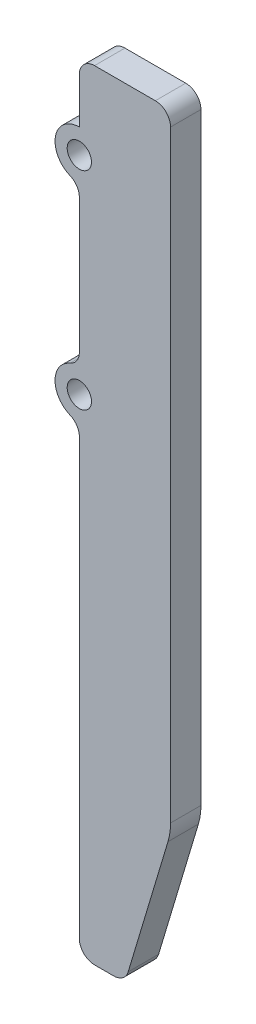
ISO-10303-21;
HEADER;
FILE_DESCRIPTION(('STEP AP214'),'2;1');
FILE_NAME('part.step','',(''),(''),'','','');
FILE_SCHEMA(('AUTOMOTIVE_DESIGN { 1 0 10303 214 1 1 1 1 }'));
ENDSEC;
DATA;
#1=APPLICATION_CONTEXT('core data for automotive mechanical design processes');
#2=APPLICATION_PROTOCOL_DEFINITION('international standard','automotive_design',2000,#1);
#3=PRODUCT_CONTEXT('',#1,'mechanical');
#4=PRODUCT('Part','Part','',(#3));
#5=PRODUCT_RELATED_PRODUCT_CATEGORY('part','',(#4));
#6=PRODUCT_DEFINITION_FORMATION('','',#4);
#7=PRODUCT_DEFINITION_CONTEXT('part definition',#1,'design');
#8=PRODUCT_DEFINITION('design','',#6,#7);
#9=PRODUCT_DEFINITION_SHAPE('','',#8);
#10=(LENGTH_UNIT() NAMED_UNIT(*) SI_UNIT(.MILLI.,.METRE.));
#11=(NAMED_UNIT(*) PLANE_ANGLE_UNIT() SI_UNIT($,.RADIAN.));
#12=(NAMED_UNIT(*) SI_UNIT($,.STERADIAN.) SOLID_ANGLE_UNIT());
#13=UNCERTAINTY_MEASURE_WITH_UNIT(LENGTH_MEASURE(1.E-05),#10,'distance_accuracy_value','');
#14=(GEOMETRIC_REPRESENTATION_CONTEXT(3) GLOBAL_UNCERTAINTY_ASSIGNED_CONTEXT((#13)) GLOBAL_UNIT_ASSIGNED_CONTEXT((#10,
#11,#12)) REPRESENTATION_CONTEXT('',''));
#15=CARTESIAN_POINT('',(0.,0.,0.));
#16=DIRECTION('',(0.,0.,1.));
#17=DIRECTION('',(1.,0.,0.));
#18=AXIS2_PLACEMENT_3D('',#15,#16,#17);
#19=CARTESIAN_POINT('',(-24.5001697636165,82.5534534534534,5.));
#20=DIRECTION('',(0.,0.,1.));
#21=DIRECTION('',(1.,0.,0.));
#22=AXIS2_PLACEMENT_3D('',#19,#20,#21);
#23=PLANE('',#22);
#24=CARTESIAN_POINT('',(-24.5001697636165,82.5534534534534,5.));
#25=DIRECTION('',(0.,0.,1.));
#26=DIRECTION('',(1.,0.,0.));
#27=AXIS2_PLACEMENT_3D('',#24,#25,#26);
#28=CIRCLE('',#27,2.);
#29=CARTESIAN_POINT('',(-22.5001697636165,82.5534534534534,5.));
#30=VERTEX_POINT('',#29);
#31=EDGE_CURVE('E206',#30,#30,#28,.T.);
#32=ORIENTED_EDGE('',*,*,#31,.F.);
#33=EDGE_LOOP('',(#32));
#34=FACE_BOUND('',#33,.T.);
#35=DIRECTION('',(0.287347885566345,0.957826285221151,0.));
#36=VECTOR('',#35,1.);
#37=CARTESIAN_POINT('',(-17.0001697636165,-31.5465465465466,5.));
#38=LINE('',#37,#36);
#39=CARTESIAN_POINT('',(-16.4656806777913,-29.7649162604624,5.));
#40=VERTEX_POINT('',#39);
#41=CARTESIAN_POINT('',(-9.921906911405,-7.95233703917485,5.));
#42=VERTEX_POINT('',#41);
#43=EDGE_CURVE('E198',#40,#42,#38,.T.);
#44=ORIENTED_EDGE('',*,*,#43,.T.);
#45=CARTESIAN_POINT('',(-19.5001697636165,-5.07885818351139,5.));
#46=DIRECTION('',(0.,0.,1.));
#47=DIRECTION('',(1.,0.,0.));
#48=AXIS2_PLACEMENT_3D('',#45,#46,#47);
#49=CIRCLE('',#48,10.);
#50=CARTESIAN_POINT('',(-9.50016976361651,-5.07885818351139,5.));
#51=VERTEX_POINT('',#50);
#52=EDGE_CURVE('E11',#42,#51,#49,.T.);
#53=ORIENTED_EDGE('',*,*,#52,.T.);
#54=DIRECTION('',(0.,1.,0.));
#55=VECTOR('',#54,1.);
#56=CARTESIAN_POINT('',(-9.50016976361652,96.5534534534534,5.));
#57=LINE('',#56,#55);
#58=CARTESIAN_POINT('',(-9.50016976361652,94.0534534534534,5.));
#59=VERTEX_POINT('',#58);
#60=EDGE_CURVE('E200',#51,#59,#57,.T.);
#61=ORIENTED_EDGE('',*,*,#60,.T.);
#62=CARTESIAN_POINT('',(-12.0001697636165,94.0534534534534,5.));
#63=DIRECTION('',(0.,0.,1.));
#64=DIRECTION('',(1.,0.,0.));
#65=AXIS2_PLACEMENT_3D('',#62,#63,#64);
#66=CIRCLE('',#65,2.5);
#67=CARTESIAN_POINT('',(-12.0001697636165,96.5534534534534,5.));
#68=VERTEX_POINT('',#67);
#69=EDGE_CURVE('E245',#59,#68,#66,.T.);
#70=ORIENTED_EDGE('',*,*,#69,.T.);
#71=DIRECTION('',(-1.,0.,0.));
#72=VECTOR('',#71,1.);
#73=CARTESIAN_POINT('',(-9.50016976361652,96.5534534534534,5.));
#74=LINE('',#73,#72);
#75=CARTESIAN_POINT('',(-22.0001697636165,96.5534534534534,5.));
#76=VERTEX_POINT('',#75);
#77=EDGE_CURVE('E166',#68,#76,#74,.T.);
#78=ORIENTED_EDGE('',*,*,#77,.T.);
#79=CARTESIAN_POINT('',(-22.0001697636165,94.0534534534534,5.));
#80=DIRECTION('',(0.,0.,1.));
#81=DIRECTION('',(1.,0.,0.));
#82=AXIS2_PLACEMENT_3D('',#79,#80,#81);
#83=CIRCLE('',#82,2.5);
#84=CARTESIAN_POINT('',(-24.5001697636165,94.0534534534534,5.));
#85=VERTEX_POINT('',#84);
#86=EDGE_CURVE('E161',#76,#85,#83,.T.);
#87=ORIENTED_EDGE('',*,*,#86,.T.);
#88=DIRECTION('',(0.,-1.,0.));
#89=VECTOR('',#88,1.);
#90=CARTESIAN_POINT('',(-24.5001697636165,96.5534534534534,5.));
#91=LINE('',#90,#89);
#92=CARTESIAN_POINT('',(-24.5001697636165,86.5534534534534,5.));
#93=VERTEX_POINT('',#92);
#94=EDGE_CURVE('E153',#85,#93,#91,.T.);
#95=ORIENTED_EDGE('',*,*,#94,.T.);
#96=CARTESIAN_POINT('',(-24.5001697636165,82.5534534534534,5.));
#97=DIRECTION('',(0.,0.,1.));
#98=DIRECTION('',(1.,0.,0.));
#99=AXIS2_PLACEMENT_3D('',#96,#97,#98);
#100=CIRCLE('',#99,4.);
#101=CARTESIAN_POINT('',(-26.038631302078,78.8611457611457,5.));
#102=VERTEX_POINT('',#101);
#103=EDGE_CURVE('E157',#93,#102,#100,.T.);
#104=ORIENTED_EDGE('',*,*,#103,.T.);
#105=CARTESIAN_POINT('',(-27.0001697636165,76.5534534534534,5.));
#106=DIRECTION('',(0.,0.,1.));
#107=DIRECTION('',(1.,0.,0.));
#108=AXIS2_PLACEMENT_3D('',#105,#106,#107);
#109=CIRCLE('',#108,2.5);
#110=CARTESIAN_POINT('',(-24.5001697636165,76.5534534534534,5.));
#111=VERTEX_POINT('',#110);
#112=EDGE_CURVE('E284',#102,#111,#109,.F.);
#113=ORIENTED_EDGE('',*,*,#112,.T.);
#114=DIRECTION('',(0.,-1.,0.));
#115=VECTOR('',#114,1.);
#116=CARTESIAN_POINT('',(-24.5001697636165,78.5534534534534,5.));
#117=LINE('',#116,#115);
#118=CARTESIAN_POINT('',(-24.5001697636165,54.4534534534535,5.));
#119=VERTEX_POINT('',#118);
#120=EDGE_CURVE('E180',#111,#119,#117,.T.);
#121=ORIENTED_EDGE('',*,*,#120,.T.);
#122=CARTESIAN_POINT('',(-27.0001697636165,54.4534534534535,5.));
#123=DIRECTION('',(0.,0.,1.));
#124=DIRECTION('',(1.,0.,0.));
#125=AXIS2_PLACEMENT_3D('',#122,#123,#124);
#126=CIRCLE('',#125,2.5);
#127=CARTESIAN_POINT('',(-26.038631302078,52.1457611457611,5.));
#128=VERTEX_POINT('',#127);
#129=EDGE_CURVE('E276',#119,#128,#126,.F.);
#130=ORIENTED_EDGE('',*,*,#129,.T.);
#131=CARTESIAN_POINT('',(-24.5001697636165,48.4534534534534,5.));
#132=DIRECTION('',(0.,0.,1.));
#133=DIRECTION('',(1.,0.,0.));
#134=AXIS2_PLACEMENT_3D('',#131,#132,#133);
#135=CIRCLE('',#134,4.);
#136=CARTESIAN_POINT('',(-26.038631302078,44.7611457611458,5.));
#137=VERTEX_POINT('',#136);
#138=EDGE_CURVE('E183',#128,#137,#135,.T.);
#139=ORIENTED_EDGE('',*,*,#138,.T.);
#140=CARTESIAN_POINT('',(-27.0001697636165,42.4534534534534,5.));
#141=DIRECTION('',(0.,0.,1.));
#142=DIRECTION('',(1.,0.,0.));
#143=AXIS2_PLACEMENT_3D('',#140,#141,#142);
#144=CIRCLE('',#143,2.5);
#145=CARTESIAN_POINT('',(-24.5001697636165,42.4534534534534,5.));
#146=VERTEX_POINT('',#145);
#147=EDGE_CURVE('E280',#137,#146,#144,.F.);
#148=ORIENTED_EDGE('',*,*,#147,.T.);
#149=DIRECTION('',(0.,-1.,0.));
#150=VECTOR('',#149,1.);
#151=CARTESIAN_POINT('',(-24.5001697636165,44.4534534534534,5.));
#152=LINE('',#151,#150);
#153=CARTESIAN_POINT('',(-24.5001697636165,-29.0465465465466,5.));
#154=VERTEX_POINT('',#153);
#155=EDGE_CURVE('E193',#146,#154,#152,.T.);
#156=ORIENTED_EDGE('',*,*,#155,.T.);
#157=CARTESIAN_POINT('',(-22.0001697636165,-29.0465465465466,5.));
#158=DIRECTION('',(0.,0.,1.));
#159=DIRECTION('',(1.,0.,0.));
#160=AXIS2_PLACEMENT_3D('',#157,#158,#159);
#161=CIRCLE('',#160,2.5);
#162=CARTESIAN_POINT('',(-22.0001697636165,-31.5465465465466,5.));
#163=VERTEX_POINT('',#162);
#164=EDGE_CURVE('E242',#154,#163,#161,.T.);
#165=ORIENTED_EDGE('',*,*,#164,.T.);
#166=DIRECTION('',(1.,0.,0.));
#167=VECTOR('',#166,1.);
#168=CARTESIAN_POINT('',(-24.5001697636165,-31.5465465465466,5.));
#169=LINE('',#168,#167);
#170=CARTESIAN_POINT('',(-18.8602463908441,-31.5465465465466,5.));
#171=VERTEX_POINT('',#170);
#172=EDGE_CURVE('E195',#163,#171,#169,.T.);
#173=ORIENTED_EDGE('',*,*,#172,.T.);
#174=CARTESIAN_POINT('',(-18.8602463908441,-29.0465465465466,5.));
#175=DIRECTION('',(0.,0.,1.));
#176=DIRECTION('',(1.,0.,0.));
#177=AXIS2_PLACEMENT_3D('',#174,#175,#176);
#178=CIRCLE('',#177,2.5);
#179=EDGE_CURVE('E240',#171,#40,#178,.T.);
#180=ORIENTED_EDGE('',*,*,#179,.T.);
#181=EDGE_LOOP('',(#44,#53,#61,#70,#78,#87,#95,#104,#113,#121,#130,#139,#148,#156,#165,#173,#180));
#182=FACE_BOUND('',#181,.T.);
#183=CARTESIAN_POINT('',(-24.5001697636165,48.4534534534534,5.));
#184=DIRECTION('',(0.,0.,1.));
#185=DIRECTION('',(1.,0.,0.));
#186=AXIS2_PLACEMENT_3D('',#183,#184,#185);
#187=CIRCLE('',#186,2.);
#188=CARTESIAN_POINT('',(-22.5001697636165,48.4534534534534,5.));
#189=VERTEX_POINT('',#188);
#190=EDGE_CURVE('E525',#189,#189,#187,.T.);
#191=ORIENTED_EDGE('',*,*,#190,.F.);
#192=EDGE_LOOP('',(#191));
#193=FACE_BOUND('',#192,.T.);
#194=ADVANCED_FACE('F34',(#34,#182,#193),#23,.T.);
#195=CARTESIAN_POINT('',(-24.5001697636165,82.5534534534534,0.));
#196=DIRECTION('',(0.,0.,1.));
#197=DIRECTION('',(1.,0.,0.));
#198=AXIS2_PLACEMENT_3D('',#195,#196,#197);
#199=PLANE('',#198);
#200=DIRECTION('',(0.,1.,0.));
#201=VECTOR('',#200,1.);
#202=CARTESIAN_POINT('',(-9.50016976361652,96.5534534534534,0.));
#203=LINE('',#202,#201);
#204=CARTESIAN_POINT('',(-9.50016976361651,-5.07885818351139,0.));
#205=VERTEX_POINT('',#204);
#206=CARTESIAN_POINT('',(-9.50016976361652,94.0534534534534,0.));
#207=VERTEX_POINT('',#206);
#208=EDGE_CURVE('E219',#205,#207,#203,.T.);
#209=ORIENTED_EDGE('',*,*,#208,.F.);
#210=CARTESIAN_POINT('',(-19.5001697636165,-5.07885818351139,0.));
#211=DIRECTION('',(0.,0.,1.));
#212=DIRECTION('',(1.,0.,0.));
#213=AXIS2_PLACEMENT_3D('',#210,#211,#212);
#214=CIRCLE('',#213,10.);
#215=CARTESIAN_POINT('',(-9.921906911405,-7.95233703917485,0.));
#216=VERTEX_POINT('',#215);
#217=EDGE_CURVE('E56',#205,#216,#214,.F.);
#218=ORIENTED_EDGE('',*,*,#217,.T.);
#219=DIRECTION('',(0.287347885566345,0.957826285221151,0.));
#220=VECTOR('',#219,1.);
#221=CARTESIAN_POINT('',(-17.0001697636165,-31.5465465465466,0.));
#222=LINE('',#221,#220);
#223=CARTESIAN_POINT('',(-16.4656806777913,-29.7649162604624,0.));
#224=VERTEX_POINT('',#223);
#225=EDGE_CURVE('E217',#224,#216,#222,.T.);
#226=ORIENTED_EDGE('',*,*,#225,.F.);
#227=CARTESIAN_POINT('',(-18.8602463908441,-29.0465465465466,0.));
#228=DIRECTION('',(0.,0.,1.));
#229=DIRECTION('',(1.,0.,0.));
#230=AXIS2_PLACEMENT_3D('',#227,#228,#229);
#231=CIRCLE('',#230,2.5);
#232=CARTESIAN_POINT('',(-18.8602463908441,-31.5465465465466,0.));
#233=VERTEX_POINT('',#232);
#234=EDGE_CURVE('E227',#224,#233,#231,.F.);
#235=ORIENTED_EDGE('',*,*,#234,.T.);
#236=DIRECTION('',(1.,0.,0.));
#237=VECTOR('',#236,1.);
#238=CARTESIAN_POINT('',(-24.5001697636165,-31.5465465465466,0.));
#239=LINE('',#238,#237);
#240=CARTESIAN_POINT('',(-22.0001697636165,-31.5465465465466,0.));
#241=VERTEX_POINT('',#240);
#242=EDGE_CURVE('E214',#241,#233,#239,.T.);
#243=ORIENTED_EDGE('',*,*,#242,.F.);
#244=CARTESIAN_POINT('',(-22.0001697636165,-29.0465465465466,0.));
#245=DIRECTION('',(0.,0.,1.));
#246=DIRECTION('',(1.,0.,0.));
#247=AXIS2_PLACEMENT_3D('',#244,#245,#246);
#248=CIRCLE('',#247,2.5);
#249=CARTESIAN_POINT('',(-24.5001697636165,-29.0465465465466,0.));
#250=VERTEX_POINT('',#249);
#251=EDGE_CURVE('E229',#241,#250,#248,.F.);
#252=ORIENTED_EDGE('',*,*,#251,.T.);
#253=DIRECTION('',(0.,-1.,0.));
#254=VECTOR('',#253,1.);
#255=CARTESIAN_POINT('',(-24.5001697636165,44.4534534534534,0.));
#256=LINE('',#255,#254);
#257=CARTESIAN_POINT('',(-24.5001697636165,42.4534534534534,0.));
#258=VERTEX_POINT('',#257);
#259=EDGE_CURVE('E212',#258,#250,#256,.T.);
#260=ORIENTED_EDGE('',*,*,#259,.F.);
#261=CARTESIAN_POINT('',(-27.0001697636165,42.4534534534534,0.));
#262=DIRECTION('',(0.,0.,1.));
#263=DIRECTION('',(1.,0.,0.));
#264=AXIS2_PLACEMENT_3D('',#261,#262,#263);
#265=CIRCLE('',#264,2.5);
#266=CARTESIAN_POINT('',(-26.038631302078,44.7611457611458,0.));
#267=VERTEX_POINT('',#266);
#268=EDGE_CURVE('E278',#258,#267,#265,.T.);
#269=ORIENTED_EDGE('',*,*,#268,.T.);
#270=CARTESIAN_POINT('',(-24.5001697636165,48.4534534534534,0.));
#271=DIRECTION('',(0.,0.,1.));
#272=DIRECTION('',(1.,0.,0.));
#273=AXIS2_PLACEMENT_3D('',#270,#271,#272);
#274=CIRCLE('',#273,4.);
#275=CARTESIAN_POINT('',(-26.038631302078,52.1457611457611,0.));
#276=VERTEX_POINT('',#275);
#277=EDGE_CURVE('E209',#276,#267,#274,.T.);
#278=ORIENTED_EDGE('',*,*,#277,.F.);
#279=CARTESIAN_POINT('',(-27.0001697636165,54.4534534534535,0.));
#280=DIRECTION('',(0.,0.,1.));
#281=DIRECTION('',(1.,0.,0.));
#282=AXIS2_PLACEMENT_3D('',#279,#280,#281);
#283=CIRCLE('',#282,2.5);
#284=CARTESIAN_POINT('',(-24.5001697636165,54.4534534534535,0.));
#285=VERTEX_POINT('',#284);
#286=EDGE_CURVE('E274',#276,#285,#283,.T.);
#287=ORIENTED_EDGE('',*,*,#286,.T.);
#288=DIRECTION('',(0.,-1.,0.));
#289=VECTOR('',#288,1.);
#290=CARTESIAN_POINT('',(-24.5001697636165,78.5534534534534,0.));
#291=LINE('',#290,#289);
#292=CARTESIAN_POINT('',(-24.5001697636165,76.5534534534534,0.));
#293=VERTEX_POINT('',#292);
#294=EDGE_CURVE('E205',#293,#285,#291,.T.);
#295=ORIENTED_EDGE('',*,*,#294,.F.);
#296=CARTESIAN_POINT('',(-27.0001697636165,76.5534534534534,0.));
#297=DIRECTION('',(0.,0.,1.));
#298=DIRECTION('',(1.,0.,0.));
#299=AXIS2_PLACEMENT_3D('',#296,#297,#298);
#300=CIRCLE('',#299,2.5);
#301=CARTESIAN_POINT('',(-26.038631302078,78.8611457611457,0.));
#302=VERTEX_POINT('',#301);
#303=EDGE_CURVE('E282',#293,#302,#300,.T.);
#304=ORIENTED_EDGE('',*,*,#303,.T.);
#305=CARTESIAN_POINT('',(-24.5001697636165,82.5534534534534,0.));
#306=DIRECTION('',(0.,0.,1.));
#307=DIRECTION('',(1.,0.,0.));
#308=AXIS2_PLACEMENT_3D('',#305,#306,#307);
#309=CIRCLE('',#308,4.);
#310=CARTESIAN_POINT('',(-24.5001697636165,86.5534534534534,0.));
#311=VERTEX_POINT('',#310);
#312=EDGE_CURVE('E203',#311,#302,#309,.T.);
#313=ORIENTED_EDGE('',*,*,#312,.F.);
#314=DIRECTION('',(0.,-1.,0.));
#315=VECTOR('',#314,1.);
#316=CARTESIAN_POINT('',(-24.5001697636165,96.5534534534534,0.));
#317=LINE('',#316,#315);
#318=CARTESIAN_POINT('',(-24.5001697636165,94.0534534534534,0.));
#319=VERTEX_POINT('',#318);
#320=EDGE_CURVE('E171',#319,#311,#317,.T.);
#321=ORIENTED_EDGE('',*,*,#320,.F.);
#322=CARTESIAN_POINT('',(-22.0001697636165,94.0534534534534,0.));
#323=DIRECTION('',(0.,0.,1.));
#324=DIRECTION('',(1.,0.,0.));
#325=AXIS2_PLACEMENT_3D('',#322,#323,#324);
#326=CIRCLE('',#325,2.5);
#327=CARTESIAN_POINT('',(-22.0001697636165,96.5534534534534,0.));
#328=VERTEX_POINT('',#327);
#329=EDGE_CURVE('E232',#319,#328,#326,.F.);
#330=ORIENTED_EDGE('',*,*,#329,.T.);
#331=DIRECTION('',(-1.,0.,0.));
#332=VECTOR('',#331,1.);
#333=CARTESIAN_POINT('',(-9.50016976361652,96.5534534534534,0.));
#334=LINE('',#333,#332);
#335=CARTESIAN_POINT('',(-12.0001697636165,96.5534534534534,0.));
#336=VERTEX_POINT('',#335);
#337=EDGE_CURVE('E185',#336,#328,#334,.T.);
#338=ORIENTED_EDGE('',*,*,#337,.F.);
#339=CARTESIAN_POINT('',(-12.0001697636165,94.0534534534534,0.));
#340=DIRECTION('',(0.,0.,1.));
#341=DIRECTION('',(1.,0.,0.));
#342=AXIS2_PLACEMENT_3D('',#339,#340,#341);
#343=CIRCLE('',#342,2.5);
#344=EDGE_CURVE('E234',#336,#207,#343,.F.);
#345=ORIENTED_EDGE('',*,*,#344,.T.);
#346=EDGE_LOOP('',(#209,#218,#226,#235,#243,#252,#260,#269,#278,#287,#295,#304,#313,#321,#330,
#338,#345));
#347=FACE_BOUND('',#346,.T.);
#348=CARTESIAN_POINT('',(-24.5001697636165,82.5534534534534,0.));
#349=DIRECTION('',(0.,0.,1.));
#350=DIRECTION('',(1.,0.,0.));
#351=AXIS2_PLACEMENT_3D('',#348,#349,#350);
#352=CIRCLE('',#351,2.);
#353=CARTESIAN_POINT('',(-22.5001697636165,82.5534534534534,0.));
#354=VERTEX_POINT('',#353);
#355=EDGE_CURVE('E188',#354,#354,#352,.T.);
#356=ORIENTED_EDGE('',*,*,#355,.T.);
#357=EDGE_LOOP('',(#356));
#358=FACE_BOUND('',#357,.T.);
#359=CARTESIAN_POINT('',(-24.5001697636165,48.4534534534534,0.));
#360=DIRECTION('',(0.,0.,1.));
#361=DIRECTION('',(1.,0.,0.));
#362=AXIS2_PLACEMENT_3D('',#359,#360,#361);
#363=CIRCLE('',#362,2.);
#364=CARTESIAN_POINT('',(-22.5001697636165,48.4534534534534,0.));
#365=VERTEX_POINT('',#364);
#366=EDGE_CURVE('E528',#365,#365,#363,.T.);
#367=ORIENTED_EDGE('',*,*,#366,.T.);
#368=EDGE_LOOP('',(#367));
#369=FACE_BOUND('',#368,.T.);
#370=ADVANCED_FACE('F295',(#347,#358,#369),#199,.F.);
#371=CARTESIAN_POINT('',(-24.5001697636165,82.5534534534534,5.));
#372=DIRECTION('',(0.,0.,-1.));
#373=DIRECTION('',(-1.,0.,0.));
#374=AXIS2_PLACEMENT_3D('',#371,#372,#373);
#375=CYLINDRICAL_SURFACE('',#374,4.);
#376=ORIENTED_EDGE('',*,*,#312,.T.);
#377=DIRECTION('',(0.,0.,-1.));
#378=VECTOR('',#377,1.);
#379=CARTESIAN_POINT('',(-26.0386313020781,78.8611457611457,5.));
#380=LINE('',#379,#378);
#381=EDGE_CURVE('E179',#302,#102,#380,.F.);
#382=ORIENTED_EDGE('',*,*,#381,.T.);
#383=ORIENTED_EDGE('',*,*,#103,.F.);
#384=DIRECTION('',(0.,0.,-1.));
#385=VECTOR('',#384,1.);
#386=CARTESIAN_POINT('',(-24.5001697636165,86.5534534534534,5.));
#387=LINE('',#386,#385);
#388=EDGE_CURVE('E165',#93,#311,#387,.T.);
#389=ORIENTED_EDGE('',*,*,#388,.T.);
#390=EDGE_LOOP('',(#376,#382,#383,#389));
#391=FACE_BOUND('',#390,.T.);
#392=ADVANCED_FACE('F177',(#391),#375,.T.);
#393=CARTESIAN_POINT('',(-24.5001697636165,78.5534534534534,5.));
#394=DIRECTION('',(1.,0.,0.));
#395=DIRECTION('',(0.,1.,0.));
#396=AXIS2_PLACEMENT_3D('',#393,#394,#395);
#397=PLANE('',#396);
#398=ORIENTED_EDGE('',*,*,#294,.T.);
#399=DIRECTION('',(0.,0.,1.));
#400=VECTOR('',#399,1.);
#401=CARTESIAN_POINT('',(-24.5001697636165,54.4534534534535,5.));
#402=LINE('',#401,#400);
#403=EDGE_CURVE('E268',#285,#119,#402,.T.);
#404=ORIENTED_EDGE('',*,*,#403,.T.);
#405=ORIENTED_EDGE('',*,*,#120,.F.);
#406=DIRECTION('',(0.,0.,1.));
#407=VECTOR('',#406,1.);
#408=CARTESIAN_POINT('',(-24.5001697636165,76.5534534534534,0.));
#409=LINE('',#408,#407);
#410=EDGE_CURVE('E265',#111,#293,#409,.F.);
#411=ORIENTED_EDGE('',*,*,#410,.T.);
#412=EDGE_LOOP('',(#398,#404,#405,#411));
#413=FACE_BOUND('',#412,.T.);
#414=ADVANCED_FACE('F316',(#413),#397,.F.);
#415=CARTESIAN_POINT('',(-24.5001697636165,48.4534534534534,5.));
#416=DIRECTION('',(0.,0.,-1.));
#417=DIRECTION('',(-1.,0.,0.));
#418=AXIS2_PLACEMENT_3D('',#415,#416,#417);
#419=CYLINDRICAL_SURFACE('',#418,4.);
#420=ORIENTED_EDGE('',*,*,#138,.F.);
#421=DIRECTION('',(0.,0.,-1.));
#422=VECTOR('',#421,1.);
#423=CARTESIAN_POINT('',(-26.038631302078,52.1457611457611,5.));
#424=LINE('',#423,#422);
#425=EDGE_CURVE('E262',#128,#276,#424,.T.);
#426=ORIENTED_EDGE('',*,*,#425,.T.);
#427=ORIENTED_EDGE('',*,*,#277,.T.);
#428=DIRECTION('',(0.,0.,-1.));
#429=VECTOR('',#428,1.);
#430=CARTESIAN_POINT('',(-26.038631302078,44.7611457611458,5.));
#431=LINE('',#430,#429);
#432=EDGE_CURVE('E260',#267,#137,#431,.F.);
#433=ORIENTED_EDGE('',*,*,#432,.T.);
#434=EDGE_LOOP('',(#420,#426,#427,#433));
#435=FACE_BOUND('',#434,.T.);
#436=ADVANCED_FACE('F324',(#435),#419,.T.);
#437=CARTESIAN_POINT('',(-24.5001697636165,44.4534534534534,5.));
#438=DIRECTION('',(1.,0.,0.));
#439=DIRECTION('',(0.,1.,0.));
#440=AXIS2_PLACEMENT_3D('',#437,#438,#439);
#441=PLANE('',#440);
#442=ORIENTED_EDGE('',*,*,#155,.F.);
#443=DIRECTION('',(0.,0.,1.));
#444=VECTOR('',#443,1.);
#445=CARTESIAN_POINT('',(-24.5001697636165,42.4534534534534,0.));
#446=LINE('',#445,#444);
#447=EDGE_CURVE('E270',#146,#258,#446,.F.);
#448=ORIENTED_EDGE('',*,*,#447,.T.);
#449=ORIENTED_EDGE('',*,*,#259,.T.);
#450=DIRECTION('',(0.,0.,-1.));
#451=VECTOR('',#450,1.);
#452=CARTESIAN_POINT('',(-24.5001697636165,-29.0465465465466,5.));
#453=LINE('',#452,#451);
#454=EDGE_CURVE('E254',#250,#154,#453,.F.);
#455=ORIENTED_EDGE('',*,*,#454,.T.);
#456=EDGE_LOOP('',(#442,#448,#449,#455));
#457=FACE_BOUND('',#456,.T.);
#458=ADVANCED_FACE('F332',(#457),#441,.F.);
#459=CARTESIAN_POINT('',(-24.5001697636165,-31.5465465465466,5.));
#460=DIRECTION('',(0.,1.,0.));
#461=DIRECTION('',(0.,0.,1.));
#462=AXIS2_PLACEMENT_3D('',#459,#460,#461);
#463=PLANE('',#462);
#464=ORIENTED_EDGE('',*,*,#172,.F.);
#465=DIRECTION('',(0.,0.,-1.));
#466=VECTOR('',#465,1.);
#467=CARTESIAN_POINT('',(-22.0001697636165,-31.5465465465466,5.));
#468=LINE('',#467,#466);
#469=EDGE_CURVE('E251',#163,#241,#468,.T.);
#470=ORIENTED_EDGE('',*,*,#469,.T.);
#471=ORIENTED_EDGE('',*,*,#242,.T.);
#472=DIRECTION('',(0.,0.,-1.));
#473=VECTOR('',#472,1.);
#474=CARTESIAN_POINT('',(-18.8602463908441,-31.5465465465466,5.));
#475=LINE('',#474,#473);
#476=EDGE_CURVE('E249',#233,#171,#475,.F.);
#477=ORIENTED_EDGE('',*,*,#476,.T.);
#478=EDGE_LOOP('',(#464,#470,#471,#477));
#479=FACE_BOUND('',#478,.T.);
#480=ADVANCED_FACE('F342',(#479),#463,.F.);
#481=CARTESIAN_POINT('',(-17.0001697636165,-31.5465465465466,5.));
#482=DIRECTION('',(-0.957826285221151,0.287347885566345,0.));
#483=DIRECTION('',(-0.287347885566345,-0.957826285221151,0.));
#484=AXIS2_PLACEMENT_3D('',#481,#482,#483);
#485=PLANE('',#484);
#486=ORIENTED_EDGE('',*,*,#225,.T.);
#487=DIRECTION('',(0.,0.,-1.));
#488=VECTOR('',#487,1.);
#489=CARTESIAN_POINT('',(-9.921906911405,-7.95233703917485,5.));
#490=LINE('',#489,#488);
#491=EDGE_CURVE('E42',#216,#42,#490,.F.);
#492=ORIENTED_EDGE('',*,*,#491,.T.);
#493=ORIENTED_EDGE('',*,*,#43,.F.);
#494=DIRECTION('',(0.,0.,-1.));
#495=VECTOR('',#494,1.);
#496=CARTESIAN_POINT('',(-16.4656806777913,-29.7649162604624,5.));
#497=LINE('',#496,#495);
#498=EDGE_CURVE('E257',#40,#224,#497,.T.);
#499=ORIENTED_EDGE('',*,*,#498,.T.);
#500=EDGE_LOOP('',(#486,#492,#493,#499));
#501=FACE_BOUND('',#500,.T.);
#502=ADVANCED_FACE('F348',(#501),#485,.F.);
#503=CARTESIAN_POINT('',(-9.50016976361652,96.5534534534534,5.));
#504=DIRECTION('',(-1.,0.,0.));
#505=DIRECTION('',(0.,-1.,0.));
#506=AXIS2_PLACEMENT_3D('',#503,#504,#505);
#507=PLANE('',#506);
#508=ORIENTED_EDGE('',*,*,#60,.F.);
#509=DIRECTION('',(0.,0.,-1.));
#510=VECTOR('',#509,1.);
#511=CARTESIAN_POINT('',(-9.50016976361651,-5.07885818351139,5.));
#512=LINE('',#511,#510);
#513=EDGE_CURVE('E286',#51,#205,#512,.T.);
#514=ORIENTED_EDGE('',*,*,#513,.T.);
#515=ORIENTED_EDGE('',*,*,#208,.T.);
#516=DIRECTION('',(0.,0.,-1.));
#517=VECTOR('',#516,1.);
#518=CARTESIAN_POINT('',(-9.50016976361652,94.0534534534534,5.));
#519=LINE('',#518,#517);
#520=EDGE_CURVE('E237',#207,#59,#519,.F.);
#521=ORIENTED_EDGE('',*,*,#520,.T.);
#522=EDGE_LOOP('',(#508,#514,#515,#521));
#523=FACE_BOUND('',#522,.T.);
#524=ADVANCED_FACE('F292',(#523),#507,.F.);
#525=CARTESIAN_POINT('',(-9.50016976361652,96.5534534534534,5.));
#526=DIRECTION('',(0.,-1.,0.));
#527=DIRECTION('',(0.,0.,-1.));
#528=AXIS2_PLACEMENT_3D('',#525,#526,#527);
#529=PLANE('',#528);
#530=ORIENTED_EDGE('',*,*,#77,.F.);
#531=DIRECTION('',(0.,0.,-1.));
#532=VECTOR('',#531,1.);
#533=CARTESIAN_POINT('',(-12.0001697636165,96.5534534534534,5.));
#534=LINE('',#533,#532);
#535=EDGE_CURVE('E224',#68,#336,#534,.T.);
#536=ORIENTED_EDGE('',*,*,#535,.T.);
#537=ORIENTED_EDGE('',*,*,#337,.T.);
#538=DIRECTION('',(0.,0.,-1.));
#539=VECTOR('',#538,1.);
#540=CARTESIAN_POINT('',(-22.0001697636165,96.5534534534534,5.));
#541=LINE('',#540,#539);
#542=EDGE_CURVE('E175',#328,#76,#541,.F.);
#543=ORIENTED_EDGE('',*,*,#542,.T.);
#544=EDGE_LOOP('',(#530,#536,#537,#543));
#545=FACE_BOUND('',#544,.T.);
#546=ADVANCED_FACE('F305',(#545),#529,.F.);
#547=CARTESIAN_POINT('',(-24.5001697636165,96.5534534534534,5.));
#548=DIRECTION('',(1.,0.,0.));
#549=DIRECTION('',(0.,0.,-1.));
#550=AXIS2_PLACEMENT_3D('',#547,#548,#549);
#551=PLANE('',#550);
#552=ORIENTED_EDGE('',*,*,#94,.F.);
#553=DIRECTION('',(0.,0.,-1.));
#554=VECTOR('',#553,1.);
#555=CARTESIAN_POINT('',(-24.5001697636165,94.0534534534534,5.));
#556=LINE('',#555,#554);
#557=EDGE_CURVE('E247',#85,#319,#556,.T.);
#558=ORIENTED_EDGE('',*,*,#557,.T.);
#559=ORIENTED_EDGE('',*,*,#320,.T.);
#560=ORIENTED_EDGE('',*,*,#388,.F.);
#561=EDGE_LOOP('',(#552,#558,#559,#560));
#562=FACE_BOUND('',#561,.T.);
#563=ADVANCED_FACE('F169',(#562),#551,.F.);
#564=CARTESIAN_POINT('',(-24.5001697636165,82.5534534534534,5.));
#565=DIRECTION('',(0.,0.,-1.));
#566=DIRECTION('',(-1.,0.,0.));
#567=AXIS2_PLACEMENT_3D('',#564,#565,#566);
#568=CYLINDRICAL_SURFACE('',#567,2.);
#569=ORIENTED_EDGE('',*,*,#31,.T.);
#570=EDGE_LOOP('',(#569));
#571=FACE_BOUND('',#570,.T.);
#572=ORIENTED_EDGE('',*,*,#355,.F.);
#573=EDGE_LOOP('',(#572));
#574=FACE_BOUND('',#573,.T.);
#575=ADVANCED_FACE('F362',(#571,#574),#568,.F.);
#576=CARTESIAN_POINT('',(-24.5001697636165,48.4534534534534,5.));
#577=DIRECTION('',(0.,0.,-1.));
#578=DIRECTION('',(-1.,0.,0.));
#579=AXIS2_PLACEMENT_3D('',#576,#577,#578);
#580=CYLINDRICAL_SURFACE('',#579,2.);
#581=ORIENTED_EDGE('',*,*,#190,.T.);
#582=EDGE_LOOP('',(#581));
#583=FACE_BOUND('',#582,.T.);
#584=ORIENTED_EDGE('',*,*,#366,.F.);
#585=EDGE_LOOP('',(#584));
#586=FACE_BOUND('',#585,.T.);
#587=ADVANCED_FACE('F385',(#583,#586),#580,.F.);
#588=CARTESIAN_POINT('',(-12.0001697636165,94.0534534534534,5.));
#589=DIRECTION('',(0.,0.,-1.));
#590=DIRECTION('',(-1.,0.,0.));
#591=AXIS2_PLACEMENT_3D('',#588,#589,#590);
#592=CYLINDRICAL_SURFACE('',#591,2.5);
#593=ORIENTED_EDGE('',*,*,#69,.F.);
#594=ORIENTED_EDGE('',*,*,#520,.F.);
#595=ORIENTED_EDGE('',*,*,#344,.F.);
#596=ORIENTED_EDGE('',*,*,#535,.F.);
#597=EDGE_LOOP('',(#593,#594,#595,#596));
#598=FACE_BOUND('',#597,.T.);
#599=ADVANCED_FACE('F302',(#598),#592,.T.);
#600=CARTESIAN_POINT('',(-22.0001697636165,94.0534534534534,5.));
#601=DIRECTION('',(0.,0.,-1.));
#602=DIRECTION('',(-1.,0.,0.));
#603=AXIS2_PLACEMENT_3D('',#600,#601,#602);
#604=CYLINDRICAL_SURFACE('',#603,2.5);
#605=ORIENTED_EDGE('',*,*,#86,.F.);
#606=ORIENTED_EDGE('',*,*,#542,.F.);
#607=ORIENTED_EDGE('',*,*,#329,.F.);
#608=ORIENTED_EDGE('',*,*,#557,.F.);
#609=EDGE_LOOP('',(#605,#606,#607,#608));
#610=FACE_BOUND('',#609,.T.);
#611=ADVANCED_FACE('F308',(#610),#604,.T.);
#612=CARTESIAN_POINT('',(-22.0001697636165,-29.0465465465466,5.));
#613=DIRECTION('',(0.,0.,-1.));
#614=DIRECTION('',(-1.,0.,0.));
#615=AXIS2_PLACEMENT_3D('',#612,#613,#614);
#616=CYLINDRICAL_SURFACE('',#615,2.5);
#617=ORIENTED_EDGE('',*,*,#164,.F.);
#618=ORIENTED_EDGE('',*,*,#454,.F.);
#619=ORIENTED_EDGE('',*,*,#251,.F.);
#620=ORIENTED_EDGE('',*,*,#469,.F.);
#621=EDGE_LOOP('',(#617,#618,#619,#620));
#622=FACE_BOUND('',#621,.T.);
#623=ADVANCED_FACE('F338',(#622),#616,.T.);
#624=CARTESIAN_POINT('',(-18.8602463908441,-29.0465465465466,5.));
#625=DIRECTION('',(0.,0.,-1.));
#626=DIRECTION('',(-1.,0.,0.));
#627=AXIS2_PLACEMENT_3D('',#624,#625,#626);
#628=CYLINDRICAL_SURFACE('',#627,2.5);
#629=ORIENTED_EDGE('',*,*,#179,.F.);
#630=ORIENTED_EDGE('',*,*,#476,.F.);
#631=ORIENTED_EDGE('',*,*,#234,.F.);
#632=ORIENTED_EDGE('',*,*,#498,.F.);
#633=EDGE_LOOP('',(#629,#630,#631,#632));
#634=FACE_BOUND('',#633,.T.);
#635=ADVANCED_FACE('F346',(#634),#628,.T.);
#636=CARTESIAN_POINT('',(-27.0001697636165,54.4534534534535,5.));
#637=DIRECTION('',(0.,0.,-1.));
#638=DIRECTION('',(-1.,0.,0.));
#639=AXIS2_PLACEMENT_3D('',#636,#637,#638);
#640=CYLINDRICAL_SURFACE('',#639,2.5);
#641=ORIENTED_EDGE('',*,*,#129,.F.);
#642=ORIENTED_EDGE('',*,*,#403,.F.);
#643=ORIENTED_EDGE('',*,*,#286,.F.);
#644=ORIENTED_EDGE('',*,*,#425,.F.);
#645=EDGE_LOOP('',(#641,#642,#643,#644));
#646=FACE_BOUND('',#645,.T.);
#647=ADVANCED_FACE('F319',(#646),#640,.F.);
#648=CARTESIAN_POINT('',(-27.0001697636165,42.4534534534534,5.));
#649=DIRECTION('',(0.,0.,-1.));
#650=DIRECTION('',(-1.,0.,0.));
#651=AXIS2_PLACEMENT_3D('',#648,#649,#650);
#652=CYLINDRICAL_SURFACE('',#651,2.5);
#653=ORIENTED_EDGE('',*,*,#147,.F.);
#654=ORIENTED_EDGE('',*,*,#432,.F.);
#655=ORIENTED_EDGE('',*,*,#268,.F.);
#656=ORIENTED_EDGE('',*,*,#447,.F.);
#657=EDGE_LOOP('',(#653,#654,#655,#656));
#658=FACE_BOUND('',#657,.T.);
#659=ADVANCED_FACE('F328',(#658),#652,.F.);
#660=CARTESIAN_POINT('',(-27.0001697636165,76.5534534534534,5.));
#661=DIRECTION('',(0.,0.,-1.));
#662=DIRECTION('',(-1.,0.,0.));
#663=AXIS2_PLACEMENT_3D('',#660,#661,#662);
#664=CYLINDRICAL_SURFACE('',#663,2.5);
#665=ORIENTED_EDGE('',*,*,#112,.F.);
#666=ORIENTED_EDGE('',*,*,#381,.F.);
#667=ORIENTED_EDGE('',*,*,#303,.F.);
#668=ORIENTED_EDGE('',*,*,#410,.F.);
#669=EDGE_LOOP('',(#665,#666,#667,#668));
#670=FACE_BOUND('',#669,.T.);
#671=ADVANCED_FACE('F311',(#670),#664,.F.);
#672=CARTESIAN_POINT('',(-19.5001697636165,-5.07885818351139,5.));
#673=DIRECTION('',(0.,0.,-1.));
#674=DIRECTION('',(-1.,0.,0.));
#675=AXIS2_PLACEMENT_3D('',#672,#673,#674);
#676=CYLINDRICAL_SURFACE('',#675,10.);
#677=ORIENTED_EDGE('',*,*,#52,.F.);
#678=ORIENTED_EDGE('',*,*,#491,.F.);
#679=ORIENTED_EDGE('',*,*,#217,.F.);
#680=ORIENTED_EDGE('',*,*,#513,.F.);
#681=EDGE_LOOP('',(#677,#678,#679,#680));
#682=FACE_BOUND('',#681,.T.);
#683=ADVANCED_FACE('F36',(#682),#676,.T.);
#684=CLOSED_SHELL('',(#194,#370,#392,#414,#436,#458,#480,#502,#524,#546,#563,#575,#587,#599,
#611,#623,#635,#647,#659,#671,#683));
#685=MANIFOLD_SOLID_BREP('B2',#684);
#686=ADVANCED_BREP_SHAPE_REPRESENTATION('',(#18,#685),#14);
#687=SHAPE_DEFINITION_REPRESENTATION(#9,#686);
ENDSEC;
END-ISO-10303-21;
